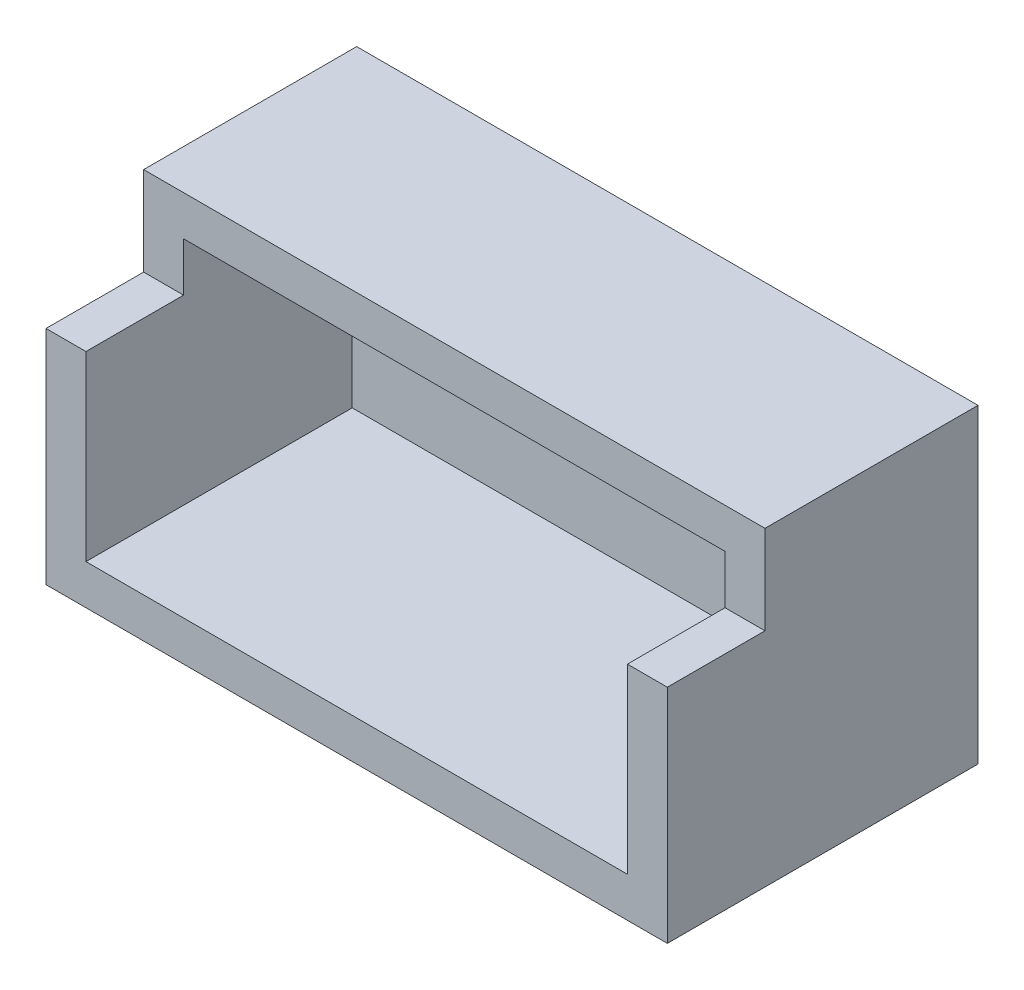
ISO-10303-21;
HEADER;
FILE_DESCRIPTION(('STEP AP214'),'2;1');
FILE_NAME('part.step','',(''),(''),'','','');
FILE_SCHEMA(('AUTOMOTIVE_DESIGN { 1 0 10303 214 1 1 1 1 }'));
ENDSEC;
DATA;
#1=APPLICATION_CONTEXT('core data for automotive mechanical design processes');
#2=APPLICATION_PROTOCOL_DEFINITION('international standard','automotive_design',2000,#1);
#3=PRODUCT_CONTEXT('',#1,'mechanical');
#4=PRODUCT('Part','Part','',(#3));
#5=PRODUCT_RELATED_PRODUCT_CATEGORY('part','',(#4));
#6=PRODUCT_DEFINITION_FORMATION('','',#4);
#7=PRODUCT_DEFINITION_CONTEXT('part definition',#1,'design');
#8=PRODUCT_DEFINITION('design','',#6,#7);
#9=PRODUCT_DEFINITION_SHAPE('','',#8);
#10=(LENGTH_UNIT() NAMED_UNIT(*) SI_UNIT(.MILLI.,.METRE.));
#11=(NAMED_UNIT(*) PLANE_ANGLE_UNIT() SI_UNIT($,.RADIAN.));
#12=(NAMED_UNIT(*) SI_UNIT($,.STERADIAN.) SOLID_ANGLE_UNIT());
#13=UNCERTAINTY_MEASURE_WITH_UNIT(LENGTH_MEASURE(1.E-05),#10,'distance_accuracy_value','');
#14=(GEOMETRIC_REPRESENTATION_CONTEXT(3) GLOBAL_UNCERTAINTY_ASSIGNED_CONTEXT((#13)) GLOBAL_UNIT_ASSIGNED_CONTEXT((#10,
#11,#12)) REPRESENTATION_CONTEXT('',''));
#15=CARTESIAN_POINT('',(0.,0.,0.));
#16=DIRECTION('',(0.,0.,1.));
#17=DIRECTION('',(1.,0.,0.));
#18=AXIS2_PLACEMENT_3D('',#15,#16,#17);
#19=CARTESIAN_POINT('',(0.,0.,6.));
#20=DIRECTION('',(0.,0.,-1.));
#21=DIRECTION('',(-1.,0.,0.));
#22=AXIS2_PLACEMENT_3D('',#19,#20,#21);
#23=PLANE('',#22);
#24=DIRECTION('',(1.,0.,0.));
#25=VECTOR('',#24,1.);
#26=CARTESIAN_POINT('',(0.,-16.,6.));
#27=LINE('',#26,#25);
#28=CARTESIAN_POINT('',(14.,-16.,6.));
#29=VERTEX_POINT('',#28);
#30=CARTESIAN_POINT('',(14.9,-16.,6.));
#31=VERTEX_POINT('',#30);
#32=EDGE_CURVE('E169',#29,#31,#27,.T.);
#33=ORIENTED_EDGE('',*,*,#32,.F.);
#34=DIRECTION('',(0.,-1.,0.));
#35=VECTOR('',#34,1.);
#36=CARTESIAN_POINT('',(14.,-21.,6.));
#37=LINE('',#36,#35);
#38=CARTESIAN_POINT('',(14.,-21.,6.));
#39=VERTEX_POINT('',#38);
#40=EDGE_CURVE('E106',#29,#39,#37,.T.);
#41=ORIENTED_EDGE('',*,*,#40,.T.);
#42=DIRECTION('',(1.,0.,0.));
#43=VECTOR('',#42,1.);
#44=CARTESIAN_POINT('',(14.,-21.,6.));
#45=LINE('',#44,#43);
#46=CARTESIAN_POINT('',(28.,-21.,6.));
#47=VERTEX_POINT('',#46);
#48=EDGE_CURVE('E63',#39,#47,#45,.T.);
#49=ORIENTED_EDGE('',*,*,#48,.T.);
#50=DIRECTION('',(0.,1.,0.));
#51=VECTOR('',#50,1.);
#52=CARTESIAN_POINT('',(28.,-21.,6.));
#53=LINE('',#52,#51);
#54=CARTESIAN_POINT('',(28.,-16.,6.));
#55=VERTEX_POINT('',#54);
#56=EDGE_CURVE('E97',#47,#55,#53,.T.);
#57=ORIENTED_EDGE('',*,*,#56,.T.);
#58=CARTESIAN_POINT('',(27.1,-16.,6.));
#59=VERTEX_POINT('',#58);
#60=EDGE_CURVE('E164',#59,#55,#27,.T.);
#61=ORIENTED_EDGE('',*,*,#60,.F.);
#62=DIRECTION('',(0.,1.,0.));
#63=VECTOR('',#62,1.);
#64=CARTESIAN_POINT('',(27.1,0.,6.));
#65=LINE('',#64,#63);
#66=CARTESIAN_POINT('',(27.1,-20.1,6.));
#67=VERTEX_POINT('',#66);
#68=EDGE_CURVE('E129',#67,#59,#65,.T.);
#69=ORIENTED_EDGE('',*,*,#68,.F.);
#70=DIRECTION('',(1.,0.,0.));
#71=VECTOR('',#70,1.);
#72=CARTESIAN_POINT('',(0.,-20.1,6.));
#73=LINE('',#72,#71);
#74=CARTESIAN_POINT('',(14.9,-20.1,6.));
#75=VERTEX_POINT('',#74);
#76=EDGE_CURVE('E133',#75,#67,#73,.T.);
#77=ORIENTED_EDGE('',*,*,#76,.F.);
#78=DIRECTION('',(0.,-1.,0.));
#79=VECTOR('',#78,1.);
#80=CARTESIAN_POINT('',(14.9,0.,6.));
#81=LINE('',#80,#79);
#82=EDGE_CURVE('E134',#31,#75,#81,.T.);
#83=ORIENTED_EDGE('',*,*,#82,.F.);
#84=EDGE_LOOP('',(#33,#41,#49,#57,#61,#69,#77,#83));
#85=FACE_BOUND('',#84,.T.);
#86=ADVANCED_FACE('F39',(#85),#23,.F.);
#87=CARTESIAN_POINT('',(14.,-21.,6.));
#88=DIRECTION('',(1.,0.,0.));
#89=DIRECTION('',(0.,0.,-1.));
#90=AXIS2_PLACEMENT_3D('',#87,#88,#89);
#91=PLANE('',#90);
#92=DIRECTION('',(0.,0.,1.));
#93=VECTOR('',#92,1.);
#94=CARTESIAN_POINT('',(14.,-16.,6.));
#95=LINE('',#94,#93);
#96=CARTESIAN_POINT('',(14.,-16.,3.8));
#97=VERTEX_POINT('',#96);
#98=EDGE_CURVE('E174',#97,#29,#95,.T.);
#99=ORIENTED_EDGE('',*,*,#98,.F.);
#100=DIRECTION('',(0.,1.,0.));
#101=VECTOR('',#100,1.);
#102=CARTESIAN_POINT('',(14.,-21.,3.8));
#103=LINE('',#102,#101);
#104=CARTESIAN_POINT('',(14.,-14.,3.8));
#105=VERTEX_POINT('',#104);
#106=EDGE_CURVE('E93',#97,#105,#103,.T.);
#107=ORIENTED_EDGE('',*,*,#106,.T.);
#108=DIRECTION('',(0.,0.,-1.));
#109=VECTOR('',#108,1.);
#110=CARTESIAN_POINT('',(14.,-14.,6.));
#111=LINE('',#110,#109);
#112=CARTESIAN_POINT('',(14.,-14.,-1.));
#113=VERTEX_POINT('',#112);
#114=EDGE_CURVE('E83',#105,#113,#111,.T.);
#115=ORIENTED_EDGE('',*,*,#114,.T.);
#116=DIRECTION('',(0.,-1.,0.));
#117=VECTOR('',#116,1.);
#118=CARTESIAN_POINT('',(14.,-21.,-1.));
#119=LINE('',#118,#117);
#120=CARTESIAN_POINT('',(14.,-21.,-1.));
#121=VERTEX_POINT('',#120);
#122=EDGE_CURVE('E87',#113,#121,#119,.T.);
#123=ORIENTED_EDGE('',*,*,#122,.T.);
#124=DIRECTION('',(0.,0.,-1.));
#125=VECTOR('',#124,1.);
#126=CARTESIAN_POINT('',(14.,-21.,6.));
#127=LINE('',#126,#125);
#128=EDGE_CURVE('E127',#39,#121,#127,.T.);
#129=ORIENTED_EDGE('',*,*,#128,.F.);
#130=ORIENTED_EDGE('',*,*,#40,.F.);
#131=EDGE_LOOP('',(#99,#107,#115,#123,#129,#130));
#132=FACE_BOUND('',#131,.T.);
#133=ADVANCED_FACE('F41',(#132),#91,.F.);
#134=CARTESIAN_POINT('',(28.,-21.,6.));
#135=DIRECTION('',(-1.,0.,0.));
#136=DIRECTION('',(0.,0.,1.));
#137=AXIS2_PLACEMENT_3D('',#134,#135,#136);
#138=PLANE('',#137);
#139=DIRECTION('',(0.,0.,-1.));
#140=VECTOR('',#139,1.);
#141=CARTESIAN_POINT('',(28.,-16.,6.));
#142=LINE('',#141,#140);
#143=CARTESIAN_POINT('',(28.,-16.,3.8));
#144=VERTEX_POINT('',#143);
#145=EDGE_CURVE('E166',#55,#144,#142,.T.);
#146=ORIENTED_EDGE('',*,*,#145,.F.);
#147=ORIENTED_EDGE('',*,*,#56,.F.);
#148=DIRECTION('',(0.,0.,-1.));
#149=VECTOR('',#148,1.);
#150=CARTESIAN_POINT('',(28.,-21.,6.));
#151=LINE('',#150,#149);
#152=CARTESIAN_POINT('',(28.,-21.,-1.));
#153=VERTEX_POINT('',#152);
#154=EDGE_CURVE('E124',#47,#153,#151,.T.);
#155=ORIENTED_EDGE('',*,*,#154,.T.);
#156=DIRECTION('',(0.,1.,0.));
#157=VECTOR('',#156,1.);
#158=CARTESIAN_POINT('',(28.,-21.,-1.));
#159=LINE('',#158,#157);
#160=CARTESIAN_POINT('',(28.,-14.,-1.));
#161=VERTEX_POINT('',#160);
#162=EDGE_CURVE('E110',#153,#161,#159,.T.);
#163=ORIENTED_EDGE('',*,*,#162,.T.);
#164=DIRECTION('',(0.,0.,-1.));
#165=VECTOR('',#164,1.);
#166=CARTESIAN_POINT('',(28.,-14.,6.));
#167=LINE('',#166,#165);
#168=CARTESIAN_POINT('',(28.,-14.,3.8));
#169=VERTEX_POINT('',#168);
#170=EDGE_CURVE('E98',#169,#161,#167,.T.);
#171=ORIENTED_EDGE('',*,*,#170,.F.);
#172=DIRECTION('',(0.,-1.,0.));
#173=VECTOR('',#172,1.);
#174=CARTESIAN_POINT('',(28.,-21.,3.8));
#175=LINE('',#174,#173);
#176=EDGE_CURVE('E163',#169,#144,#175,.T.);
#177=ORIENTED_EDGE('',*,*,#176,.T.);
#178=EDGE_LOOP('',(#146,#147,#155,#163,#171,#177));
#179=FACE_BOUND('',#178,.T.);
#180=ADVANCED_FACE('F206',(#179),#138,.F.);
#181=CARTESIAN_POINT('',(14.9,-20.1,7.));
#182=DIRECTION('',(1.,0.,0.));
#183=DIRECTION('',(0.,0.,-1.));
#184=AXIS2_PLACEMENT_3D('',#181,#182,#183);
#185=PLANE('',#184);
#186=DIRECTION('',(0.,1.,0.));
#187=VECTOR('',#186,1.);
#188=CARTESIAN_POINT('',(14.9,-20.1,3.8));
#189=LINE('',#188,#187);
#190=CARTESIAN_POINT('',(14.9,-16.,3.8));
#191=VERTEX_POINT('',#190);
#192=CARTESIAN_POINT('',(14.9,-14.9,3.8));
#193=VERTEX_POINT('',#192);
#194=EDGE_CURVE('E57',#191,#193,#189,.T.);
#195=ORIENTED_EDGE('',*,*,#194,.F.);
#196=DIRECTION('',(0.,0.,1.));
#197=VECTOR('',#196,1.);
#198=CARTESIAN_POINT('',(14.9,-16.,7.));
#199=LINE('',#198,#197);
#200=EDGE_CURVE('E175',#191,#31,#199,.T.);
#201=ORIENTED_EDGE('',*,*,#200,.T.);
#202=ORIENTED_EDGE('',*,*,#82,.T.);
#203=DIRECTION('',(0.,0.,-1.));
#204=VECTOR('',#203,1.);
#205=CARTESIAN_POINT('',(14.9,-20.1,7.));
#206=LINE('',#205,#204);
#207=CARTESIAN_POINT('',(14.9,-20.1,0.));
#208=VERTEX_POINT('',#207);
#209=EDGE_CURVE('E115',#75,#208,#206,.T.);
#210=ORIENTED_EDGE('',*,*,#209,.T.);
#211=DIRECTION('',(0.,-1.,0.));
#212=VECTOR('',#211,1.);
#213=CARTESIAN_POINT('',(14.9,-20.1,0.));
#214=LINE('',#213,#212);
#215=CARTESIAN_POINT('',(14.9,-14.9,0.));
#216=VERTEX_POINT('',#215);
#217=EDGE_CURVE('E178',#216,#208,#214,.T.);
#218=ORIENTED_EDGE('',*,*,#217,.F.);
#219=DIRECTION('',(0.,0.,-1.));
#220=VECTOR('',#219,1.);
#221=CARTESIAN_POINT('',(14.9,-14.9,7.));
#222=LINE('',#221,#220);
#223=EDGE_CURVE('E188',#193,#216,#222,.T.);
#224=ORIENTED_EDGE('',*,*,#223,.F.);
#225=EDGE_LOOP('',(#195,#201,#202,#210,#218,#224));
#226=FACE_BOUND('',#225,.T.);
#227=ADVANCED_FACE('F242',(#226),#185,.T.);
#228=CARTESIAN_POINT('',(27.1,-20.1,7.));
#229=DIRECTION('',(-1.,0.,0.));
#230=DIRECTION('',(0.,0.,1.));
#231=AXIS2_PLACEMENT_3D('',#228,#229,#230);
#232=PLANE('',#231);
#233=ORIENTED_EDGE('',*,*,#68,.T.);
#234=DIRECTION('',(0.,0.,-1.));
#235=VECTOR('',#234,1.);
#236=CARTESIAN_POINT('',(27.1,-16.,7.));
#237=LINE('',#236,#235);
#238=CARTESIAN_POINT('',(27.1,-16.,3.8));
#239=VERTEX_POINT('',#238);
#240=EDGE_CURVE('E11',#59,#239,#237,.T.);
#241=ORIENTED_EDGE('',*,*,#240,.T.);
#242=DIRECTION('',(0.,-1.,0.));
#243=VECTOR('',#242,1.);
#244=CARTESIAN_POINT('',(27.1,-20.1,3.8));
#245=LINE('',#244,#243);
#246=CARTESIAN_POINT('',(27.1,-14.9,3.8));
#247=VERTEX_POINT('',#246);
#248=EDGE_CURVE('E152',#247,#239,#245,.T.);
#249=ORIENTED_EDGE('',*,*,#248,.F.);
#250=DIRECTION('',(0.,0.,-1.));
#251=VECTOR('',#250,1.);
#252=CARTESIAN_POINT('',(27.1,-14.9,7.));
#253=LINE('',#252,#251);
#254=CARTESIAN_POINT('',(27.1,-14.9,0.));
#255=VERTEX_POINT('',#254);
#256=EDGE_CURVE('E194',#247,#255,#253,.T.);
#257=ORIENTED_EDGE('',*,*,#256,.T.);
#258=DIRECTION('',(0.,1.,0.));
#259=VECTOR('',#258,1.);
#260=CARTESIAN_POINT('',(27.1,-20.1,0.));
#261=LINE('',#260,#259);
#262=CARTESIAN_POINT('',(27.1,-20.1,0.));
#263=VERTEX_POINT('',#262);
#264=EDGE_CURVE('E183',#263,#255,#261,.T.);
#265=ORIENTED_EDGE('',*,*,#264,.F.);
#266=DIRECTION('',(0.,0.,-1.));
#267=VECTOR('',#266,1.);
#268=CARTESIAN_POINT('',(27.1,-20.1,7.));
#269=LINE('',#268,#267);
#270=EDGE_CURVE('E116',#67,#263,#269,.T.);
#271=ORIENTED_EDGE('',*,*,#270,.F.);
#272=EDGE_LOOP('',(#233,#241,#249,#257,#265,#271));
#273=FACE_BOUND('',#272,.T.);
#274=ADVANCED_FACE('F228',(#273),#232,.T.);
#275=CARTESIAN_POINT('',(14.,-21.,6.));
#276=DIRECTION('',(0.,1.,0.));
#277=DIRECTION('',(0.,0.,1.));
#278=AXIS2_PLACEMENT_3D('',#275,#276,#277);
#279=PLANE('',#278);
#280=DIRECTION('',(1.,0.,0.));
#281=VECTOR('',#280,1.);
#282=CARTESIAN_POINT('',(14.,-21.,-1.));
#283=LINE('',#282,#281);
#284=EDGE_CURVE('E109',#121,#153,#283,.T.);
#285=ORIENTED_EDGE('',*,*,#284,.T.);
#286=ORIENTED_EDGE('',*,*,#154,.F.);
#287=ORIENTED_EDGE('',*,*,#48,.F.);
#288=ORIENTED_EDGE('',*,*,#128,.T.);
#289=EDGE_LOOP('',(#285,#286,#287,#288));
#290=FACE_BOUND('',#289,.T.);
#291=ADVANCED_FACE('F272',(#290),#279,.F.);
#292=CARTESIAN_POINT('',(14.,-14.,6.));
#293=DIRECTION('',(0.,-1.,0.));
#294=DIRECTION('',(0.,0.,-1.));
#295=AXIS2_PLACEMENT_3D('',#292,#293,#294);
#296=PLANE('',#295);
#297=ORIENTED_EDGE('',*,*,#114,.F.);
#298=DIRECTION('',(1.,0.,0.));
#299=VECTOR('',#298,1.);
#300=CARTESIAN_POINT('',(14.,-14.,3.8));
#301=LINE('',#300,#299);
#302=EDGE_CURVE('E159',#105,#169,#301,.T.);
#303=ORIENTED_EDGE('',*,*,#302,.T.);
#304=ORIENTED_EDGE('',*,*,#170,.T.);
#305=DIRECTION('',(-1.,0.,0.));
#306=VECTOR('',#305,1.);
#307=CARTESIAN_POINT('',(14.,-14.,-1.));
#308=LINE('',#307,#306);
#309=EDGE_CURVE('E99',#161,#113,#308,.T.);
#310=ORIENTED_EDGE('',*,*,#309,.T.);
#311=EDGE_LOOP('',(#297,#303,#304,#310));
#312=FACE_BOUND('',#311,.T.);
#313=ADVANCED_FACE('F103',(#312),#296,.F.);
#314=CARTESIAN_POINT('',(0.,0.,-1.));
#315=DIRECTION('',(0.,0.,-1.));
#316=DIRECTION('',(-1.,0.,0.));
#317=AXIS2_PLACEMENT_3D('',#314,#315,#316);
#318=PLANE('',#317);
#319=CARTESIAN_POINT('',(18.,-17.5,-1.));
#320=DIRECTION('',(0.,0.,-1.));
#321=DIRECTION('',(-1.,0.,0.));
#322=AXIS2_PLACEMENT_3D('',#319,#320,#321);
#323=CIRCLE('',#322,1.1);
#324=CARTESIAN_POINT('',(16.9,-17.5,-1.));
#325=VERTEX_POINT('',#324);
#326=EDGE_CURVE('E150',#325,#325,#323,.F.);
#327=ORIENTED_EDGE('',*,*,#326,.T.);
#328=EDGE_LOOP('',(#327));
#329=FACE_BOUND('',#328,.T.);
#330=CARTESIAN_POINT('',(24.,-17.5,-1.));
#331=DIRECTION('',(0.,0.,-1.));
#332=DIRECTION('',(-1.,0.,0.));
#333=AXIS2_PLACEMENT_3D('',#330,#331,#332);
#334=CIRCLE('',#333,1.1);
#335=CARTESIAN_POINT('',(22.9,-17.5,-1.));
#336=VERTEX_POINT('',#335);
#337=EDGE_CURVE('E139',#336,#336,#334,.F.);
#338=ORIENTED_EDGE('',*,*,#337,.T.);
#339=EDGE_LOOP('',(#338));
#340=FACE_BOUND('',#339,.T.);
#341=ORIENTED_EDGE('',*,*,#122,.F.);
#342=ORIENTED_EDGE('',*,*,#309,.F.);
#343=ORIENTED_EDGE('',*,*,#162,.F.);
#344=ORIENTED_EDGE('',*,*,#284,.F.);
#345=EDGE_LOOP('',(#341,#342,#343,#344));
#346=FACE_BOUND('',#345,.T.);
#347=ADVANCED_FACE('F107',(#329,#340,#346),#318,.T.);
#348=CARTESIAN_POINT('',(14.9,-20.1,7.));
#349=DIRECTION('',(0.,1.,0.));
#350=DIRECTION('',(0.,0.,1.));
#351=AXIS2_PLACEMENT_3D('',#348,#349,#350);
#352=PLANE('',#351);
#353=ORIENTED_EDGE('',*,*,#76,.T.);
#354=ORIENTED_EDGE('',*,*,#270,.T.);
#355=DIRECTION('',(1.,0.,0.));
#356=VECTOR('',#355,1.);
#357=CARTESIAN_POINT('',(14.9,-20.1,0.));
#358=LINE('',#357,#356);
#359=EDGE_CURVE('E181',#208,#263,#358,.T.);
#360=ORIENTED_EDGE('',*,*,#359,.F.);
#361=ORIENTED_EDGE('',*,*,#209,.F.);
#362=EDGE_LOOP('',(#353,#354,#360,#361));
#363=FACE_BOUND('',#362,.T.);
#364=ADVANCED_FACE('F255',(#363),#352,.T.);
#365=CARTESIAN_POINT('',(14.9,-14.9,7.));
#366=DIRECTION('',(0.,-1.,0.));
#367=DIRECTION('',(0.,0.,-1.));
#368=AXIS2_PLACEMENT_3D('',#365,#366,#367);
#369=PLANE('',#368);
#370=DIRECTION('',(1.,0.,0.));
#371=VECTOR('',#370,1.);
#372=CARTESIAN_POINT('',(14.9,-14.9,3.8));
#373=LINE('',#372,#371);
#374=EDGE_CURVE('E48',#193,#247,#373,.T.);
#375=ORIENTED_EDGE('',*,*,#374,.F.);
#376=ORIENTED_EDGE('',*,*,#223,.T.);
#377=DIRECTION('',(-1.,0.,0.));
#378=VECTOR('',#377,1.);
#379=CARTESIAN_POINT('',(14.9,-14.9,0.));
#380=LINE('',#379,#378);
#381=EDGE_CURVE('E190',#255,#216,#380,.T.);
#382=ORIENTED_EDGE('',*,*,#381,.F.);
#383=ORIENTED_EDGE('',*,*,#256,.F.);
#384=EDGE_LOOP('',(#375,#376,#382,#383));
#385=FACE_BOUND('',#384,.T.);
#386=ADVANCED_FACE('F235',(#385),#369,.T.);
#387=CARTESIAN_POINT('',(0.,0.,0.));
#388=DIRECTION('',(0.,0.,-1.));
#389=DIRECTION('',(-1.,0.,0.));
#390=AXIS2_PLACEMENT_3D('',#387,#388,#389);
#391=PLANE('',#390);
#392=CARTESIAN_POINT('',(18.,-17.5,0.));
#393=DIRECTION('',(0.,0.,-1.));
#394=DIRECTION('',(-1.,0.,0.));
#395=AXIS2_PLACEMENT_3D('',#392,#393,#394);
#396=CIRCLE('',#395,1.1);
#397=CARTESIAN_POINT('',(16.9,-17.5,0.));
#398=VERTEX_POINT('',#397);
#399=EDGE_CURVE('E43',#398,#398,#396,.F.);
#400=ORIENTED_EDGE('',*,*,#399,.F.);
#401=EDGE_LOOP('',(#400));
#402=FACE_BOUND('',#401,.T.);
#403=CARTESIAN_POINT('',(24.,-17.5,0.));
#404=DIRECTION('',(0.,0.,-1.));
#405=DIRECTION('',(-1.,0.,0.));
#406=AXIS2_PLACEMENT_3D('',#403,#404,#405);
#407=CIRCLE('',#406,1.1);
#408=CARTESIAN_POINT('',(22.9,-17.5,0.));
#409=VERTEX_POINT('',#408);
#410=EDGE_CURVE('E140',#409,#409,#407,.F.);
#411=ORIENTED_EDGE('',*,*,#410,.F.);
#412=EDGE_LOOP('',(#411));
#413=FACE_BOUND('',#412,.T.);
#414=ORIENTED_EDGE('',*,*,#217,.T.);
#415=ORIENTED_EDGE('',*,*,#359,.T.);
#416=ORIENTED_EDGE('',*,*,#264,.T.);
#417=ORIENTED_EDGE('',*,*,#381,.T.);
#418=EDGE_LOOP('',(#414,#415,#416,#417));
#419=FACE_BOUND('',#418,.T.);
#420=ADVANCED_FACE('F237',(#402,#413,#419),#391,.F.);
#421=CARTESIAN_POINT('',(13.,-16.,7.));
#422=DIRECTION('',(0.,1.,0.));
#423=DIRECTION('',(0.,0.,1.));
#424=AXIS2_PLACEMENT_3D('',#421,#422,#423);
#425=PLANE('',#424);
#426=ORIENTED_EDGE('',*,*,#98,.T.);
#427=ORIENTED_EDGE('',*,*,#32,.T.);
#428=ORIENTED_EDGE('',*,*,#200,.F.);
#429=DIRECTION('',(1.,0.,0.));
#430=VECTOR('',#429,1.);
#431=CARTESIAN_POINT('',(13.,-16.,3.8));
#432=LINE('',#431,#430);
#433=EDGE_CURVE('E154',#97,#191,#432,.T.);
#434=ORIENTED_EDGE('',*,*,#433,.F.);
#435=EDGE_LOOP('',(#426,#427,#428,#434));
#436=FACE_BOUND('',#435,.T.);
#437=ADVANCED_FACE('F268',(#436),#425,.T.);
#438=ORIENTED_EDGE('',*,*,#145,.T.);
#439=EDGE_CURVE('E153',#239,#144,#432,.T.);
#440=ORIENTED_EDGE('',*,*,#439,.F.);
#441=ORIENTED_EDGE('',*,*,#240,.F.);
#442=ORIENTED_EDGE('',*,*,#60,.T.);
#443=EDGE_LOOP('',(#438,#440,#441,#442));
#444=FACE_BOUND('',#443,.T.);
#445=ADVANCED_FACE('F214',(#444),#425,.T.);
#446=CARTESIAN_POINT('',(0.,0.,3.8));
#447=DIRECTION('',(0.,0.,-1.));
#448=DIRECTION('',(-1.,0.,0.));
#449=AXIS2_PLACEMENT_3D('',#446,#447,#448);
#450=PLANE('',#449);
#451=ORIENTED_EDGE('',*,*,#433,.T.);
#452=ORIENTED_EDGE('',*,*,#194,.T.);
#453=ORIENTED_EDGE('',*,*,#374,.T.);
#454=ORIENTED_EDGE('',*,*,#248,.T.);
#455=ORIENTED_EDGE('',*,*,#439,.T.);
#456=ORIENTED_EDGE('',*,*,#176,.F.);
#457=ORIENTED_EDGE('',*,*,#302,.F.);
#458=ORIENTED_EDGE('',*,*,#106,.F.);
#459=EDGE_LOOP('',(#451,#452,#453,#454,#455,#456,#457,#458));
#460=FACE_BOUND('',#459,.T.);
#461=ADVANCED_FACE('F216',(#460),#450,.F.);
#462=CARTESIAN_POINT('',(24.,-17.5,6.));
#463=DIRECTION('',(0.,0.,-1.));
#464=DIRECTION('',(-1.,0.,0.));
#465=AXIS2_PLACEMENT_3D('',#462,#463,#464);
#466=CYLINDRICAL_SURFACE('',#465,1.1);
#467=ORIENTED_EDGE('',*,*,#337,.F.);
#468=EDGE_LOOP('',(#467));
#469=FACE_BOUND('',#468,.T.);
#470=ORIENTED_EDGE('',*,*,#410,.T.);
#471=EDGE_LOOP('',(#470));
#472=FACE_BOUND('',#471,.T.);
#473=ADVANCED_FACE('F331',(#469,#472),#466,.F.);
#474=CARTESIAN_POINT('',(18.,-17.5,6.));
#475=DIRECTION('',(0.,0.,-1.));
#476=DIRECTION('',(-1.,0.,0.));
#477=AXIS2_PLACEMENT_3D('',#474,#475,#476);
#478=CYLINDRICAL_SURFACE('',#477,1.1);
#479=ORIENTED_EDGE('',*,*,#326,.F.);
#480=EDGE_LOOP('',(#479));
#481=FACE_BOUND('',#480,.T.);
#482=ORIENTED_EDGE('',*,*,#399,.T.);
#483=EDGE_LOOP('',(#482));
#484=FACE_BOUND('',#483,.T.);
#485=ADVANCED_FACE('F354',(#481,#484),#478,.F.);
#486=CLOSED_SHELL('',(#86,#133,#180,#227,#274,#291,#313,#347,#364,#386,#420,#437,#445,#461,#473,#485));
#487=MANIFOLD_SOLID_BREP('B2',#486);
#488=ADVANCED_BREP_SHAPE_REPRESENTATION('',(#18,#487),#14);
#489=SHAPE_DEFINITION_REPRESENTATION(#9,#488);
ENDSEC;
END-ISO-10303-21;
